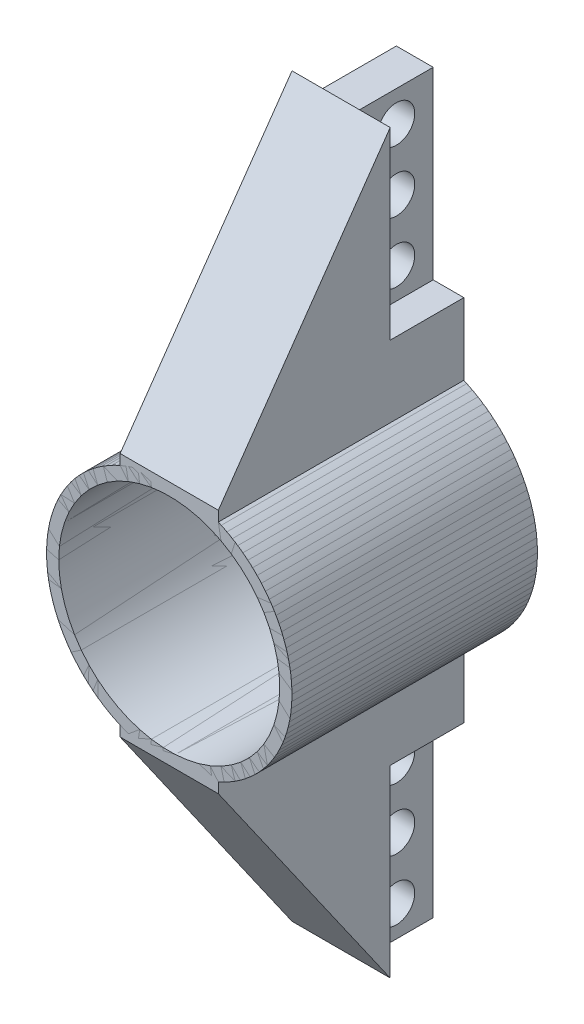
ISO-10303-21;
HEADER;
FILE_DESCRIPTION(('STEP AP214'),'2;1');
FILE_NAME('part.step','',(''),(''),'','','');
FILE_SCHEMA(('AUTOMOTIVE_DESIGN { 1 0 10303 214 1 1 1 1 }'));
ENDSEC;
DATA;
#1=APPLICATION_CONTEXT('core data for automotive mechanical design processes');
#2=APPLICATION_PROTOCOL_DEFINITION('international standard','automotive_design',2000,#1);
#3=PRODUCT_CONTEXT('',#1,'mechanical');
#4=PRODUCT('Part','Part','',(#3));
#5=PRODUCT_RELATED_PRODUCT_CATEGORY('part','',(#4));
#6=PRODUCT_DEFINITION_FORMATION('','',#4);
#7=PRODUCT_DEFINITION_CONTEXT('part definition',#1,'design');
#8=PRODUCT_DEFINITION('design','',#6,#7);
#9=PRODUCT_DEFINITION_SHAPE('','',#8);
#10=(LENGTH_UNIT() NAMED_UNIT(*) SI_UNIT(.MILLI.,.METRE.));
#11=(NAMED_UNIT(*) PLANE_ANGLE_UNIT() SI_UNIT($,.RADIAN.));
#12=(NAMED_UNIT(*) SI_UNIT($,.STERADIAN.) SOLID_ANGLE_UNIT());
#13=UNCERTAINTY_MEASURE_WITH_UNIT(LENGTH_MEASURE(1.E-05),#10,'distance_accuracy_value','');
#14=(GEOMETRIC_REPRESENTATION_CONTEXT(3) GLOBAL_UNCERTAINTY_ASSIGNED_CONTEXT((#13)) GLOBAL_UNIT_ASSIGNED_CONTEXT((#10,
#11,#12)) REPRESENTATION_CONTEXT('',''));
#15=CARTESIAN_POINT('',(0.,0.,0.));
#16=DIRECTION('',(0.,0.,1.));
#17=DIRECTION('',(1.,0.,0.));
#18=AXIS2_PLACEMENT_3D('',#15,#16,#17);
#19=CARTESIAN_POINT('',(0.,0.,20.));
#20=DIRECTION('',(0.,0.,-1.));
#21=DIRECTION('',(1.,0.,0.));
#22=AXIS2_PLACEMENT_3D('',#19,#20,#21);
#23=CYLINDRICAL_SURFACE('',#22,10.);
#24=DIRECTION('',(0.,0.,-1.));
#25=VECTOR('',#24,1.);
#26=CARTESIAN_POINT('',(-3.99999999999994,-9.16515138991171,20.));
#27=LINE('',#26,#25);
#28=CARTESIAN_POINT('',(-3.99999999999994,-9.16515138991171,20.));
#29=VERTEX_POINT('',#28);
#30=CARTESIAN_POINT('',(-3.99999999999994,-9.16515138991171,0.));
#31=VERTEX_POINT('',#30);
#32=EDGE_CURVE('E208',#29,#31,#27,.T.);
#33=ORIENTED_EDGE('',*,*,#32,.F.);
#34=CARTESIAN_POINT('',(0.,0.,20.));
#35=DIRECTION('',(0.,0.,1.));
#36=DIRECTION('',(-1.,0.,0.));
#37=AXIS2_PLACEMENT_3D('',#34,#35,#36);
#38=CIRCLE('',#37,10.);
#39=CARTESIAN_POINT('',(4.00000000000006,-9.16515138991165,20.));
#40=VERTEX_POINT('',#39);
#41=EDGE_CURVE('E12',#40,#29,#38,.T.);
#42=ORIENTED_EDGE('',*,*,#41,.F.);
#43=DIRECTION('',(0.,0.,-1.));
#44=VECTOR('',#43,1.);
#45=CARTESIAN_POINT('',(4.00000000000006,-9.16515138991165,20.));
#46=LINE('',#45,#44);
#47=CARTESIAN_POINT('',(4.00000000000006,-9.16515138991165,0.));
#48=VERTEX_POINT('',#47);
#49=EDGE_CURVE('E206',#40,#48,#46,.T.);
#50=ORIENTED_EDGE('',*,*,#49,.T.);
#51=CARTESIAN_POINT('',(0.,0.,0.));
#52=DIRECTION('',(0.,0.,1.));
#53=DIRECTION('',(-1.,0.,0.));
#54=AXIS2_PLACEMENT_3D('',#51,#52,#53);
#55=CIRCLE('',#54,10.);
#56=EDGE_CURVE('E63',#48,#31,#55,.T.);
#57=ORIENTED_EDGE('',*,*,#56,.T.);
#58=EDGE_LOOP('',(#33,#42,#50,#57));
#59=FACE_BOUND('',#58,.T.);
#60=ADVANCED_FACE('F55',(#59),#23,.T.);
#61=CARTESIAN_POINT('',(0.,0.,20.));
#62=DIRECTION('',(0.,0.,-1.));
#63=DIRECTION('',(1.,0.,0.));
#64=AXIS2_PLACEMENT_3D('',#61,#62,#63);
#65=CYLINDRICAL_SURFACE('',#64,9.);
#66=CARTESIAN_POINT('',(0.,0.,0.));
#67=DIRECTION('',(0.,0.,1.));
#68=DIRECTION('',(-1.,0.,0.));
#69=AXIS2_PLACEMENT_3D('',#66,#67,#68);
#70=CIRCLE('',#69,9.);
#71=CARTESIAN_POINT('',(-9.,0.,0.));
#72=VERTEX_POINT('',#71);
#73=EDGE_CURVE('E210',#72,#72,#70,.T.);
#74=ORIENTED_EDGE('',*,*,#73,.F.);
#75=EDGE_LOOP('',(#74));
#76=FACE_BOUND('',#75,.T.);
#77=CARTESIAN_POINT('',(0.,0.,20.));
#78=DIRECTION('',(0.,0.,1.));
#79=DIRECTION('',(-1.,0.,0.));
#80=AXIS2_PLACEMENT_3D('',#77,#78,#79);
#81=CIRCLE('',#80,9.);
#82=CARTESIAN_POINT('',(-9.,0.,20.));
#83=VERTEX_POINT('',#82);
#84=EDGE_CURVE('E211',#83,#83,#81,.T.);
#85=ORIENTED_EDGE('',*,*,#84,.T.);
#86=EDGE_LOOP('',(#85));
#87=FACE_BOUND('',#86,.T.);
#88=ADVANCED_FACE('F243',(#76,#87),#65,.F.);
#89=CARTESIAN_POINT('',(0.,0.,20.));
#90=DIRECTION('',(0.,0.,1.));
#91=DIRECTION('',(-1.,0.,0.));
#92=AXIS2_PLACEMENT_3D('',#89,#90,#91);
#93=PLANE('',#92);
#94=ORIENTED_EDGE('',*,*,#84,.F.);
#95=EDGE_LOOP('',(#94));
#96=FACE_BOUND('',#95,.T.);
#97=ORIENTED_EDGE('',*,*,#41,.T.);
#98=DIRECTION('',(0.,1.,0.));
#99=VECTOR('',#98,1.);
#100=CARTESIAN_POINT('',(-3.99999999999993,-10.,20.));
#101=LINE('',#100,#99);
#102=CARTESIAN_POINT('',(-3.99999999999993,-10.,20.));
#103=VERTEX_POINT('',#102);
#104=EDGE_CURVE('E187',#103,#29,#101,.T.);
#105=ORIENTED_EDGE('',*,*,#104,.F.);
#106=DIRECTION('',(1.,0.,0.));
#107=VECTOR('',#106,1.);
#108=CARTESIAN_POINT('',(-3.99999999999993,-10.,20.));
#109=LINE('',#108,#107);
#110=CARTESIAN_POINT('',(4.00000000000007,-9.99999999999997,20.));
#111=VERTEX_POINT('',#110);
#112=EDGE_CURVE('E204',#103,#111,#109,.T.);
#113=ORIENTED_EDGE('',*,*,#112,.T.);
#114=DIRECTION('',(0.,1.,0.));
#115=VECTOR('',#114,1.);
#116=CARTESIAN_POINT('',(4.00000000000007,-9.99999999999997,20.));
#117=LINE('',#116,#115);
#118=EDGE_CURVE('E194',#111,#40,#117,.T.);
#119=ORIENTED_EDGE('',*,*,#118,.T.);
#120=EDGE_LOOP('',(#97,#105,#113,#119));
#121=FACE_BOUND('',#120,.T.);
#122=ADVANCED_FACE('F249',(#96,#121),#93,.T.);
#123=CARTESIAN_POINT('',(0.,0.,0.));
#124=DIRECTION('',(0.,0.,1.));
#125=DIRECTION('',(-1.,0.,0.));
#126=AXIS2_PLACEMENT_3D('',#123,#124,#125);
#127=PLANE('',#126);
#128=ORIENTED_EDGE('',*,*,#73,.T.);
#129=EDGE_LOOP('',(#128));
#130=FACE_BOUND('',#129,.T.);
#131=DIRECTION('',(1.,0.,0.));
#132=VECTOR('',#131,1.);
#133=CARTESIAN_POINT('',(4.0000000000001,-15.,0.));
#134=LINE('',#133,#132);
#135=CARTESIAN_POINT('',(1.5000000000001,-15.,0.));
#136=VERTEX_POINT('',#135);
#137=CARTESIAN_POINT('',(4.0000000000001,-15.,0.));
#138=VERTEX_POINT('',#137);
#139=EDGE_CURVE('E150',#136,#138,#134,.T.);
#140=ORIENTED_EDGE('',*,*,#139,.F.);
#141=DIRECTION('',(0.,-1.,0.));
#142=VECTOR('',#141,1.);
#143=CARTESIAN_POINT('',(1.5000000000001,-15.,0.));
#144=LINE('',#143,#142);
#145=CARTESIAN_POINT('',(1.50000000000021,-30.,0.));
#146=VERTEX_POINT('',#145);
#147=EDGE_CURVE('E159',#136,#146,#144,.T.);
#148=ORIENTED_EDGE('',*,*,#147,.T.);
#149=DIRECTION('',(1.,0.,0.));
#150=VECTOR('',#149,1.);
#151=CARTESIAN_POINT('',(-3.99999999999979,-30.,0.));
#152=LINE('',#151,#150);
#153=CARTESIAN_POINT('',(-1.49999999999979,-30.,0.));
#154=VERTEX_POINT('',#153);
#155=EDGE_CURVE('E201',#154,#146,#152,.T.);
#156=ORIENTED_EDGE('',*,*,#155,.F.);
#157=DIRECTION('',(0.,-1.,0.));
#158=VECTOR('',#157,1.);
#159=CARTESIAN_POINT('',(-1.4999999999999,-15.,0.));
#160=LINE('',#159,#158);
#161=CARTESIAN_POINT('',(-1.4999999999999,-15.,0.));
#162=VERTEX_POINT('',#161);
#163=EDGE_CURVE('E71',#162,#154,#160,.T.);
#164=ORIENTED_EDGE('',*,*,#163,.F.);
#165=DIRECTION('',(1.,0.,0.));
#166=VECTOR('',#165,1.);
#167=CARTESIAN_POINT('',(-3.9999999999999,-15.,0.));
#168=LINE('',#167,#166);
#169=CARTESIAN_POINT('',(-3.9999999999999,-15.,0.));
#170=VERTEX_POINT('',#169);
#171=EDGE_CURVE('E180',#170,#162,#168,.T.);
#172=ORIENTED_EDGE('',*,*,#171,.F.);
#173=DIRECTION('',(0.,-1.,0.));
#174=VECTOR('',#173,1.);
#175=CARTESIAN_POINT('',(-3.99999999999996,-6.50000000000003,0.));
#176=LINE('',#175,#174);
#177=EDGE_CURVE('E189',#31,#170,#176,.T.);
#178=ORIENTED_EDGE('',*,*,#177,.F.);
#179=ORIENTED_EDGE('',*,*,#56,.F.);
#180=DIRECTION('',(0.,-1.,0.));
#181=VECTOR('',#180,1.);
#182=CARTESIAN_POINT('',(4.00000000000005,-6.49999999999997,0.));
#183=LINE('',#182,#181);
#184=EDGE_CURVE('E79',#48,#138,#183,.T.);
#185=ORIENTED_EDGE('',*,*,#184,.T.);
#186=EDGE_LOOP('',(#140,#148,#156,#164,#172,#178,#179,#185));
#187=FACE_BOUND('',#186,.T.);
#188=ADVANCED_FACE('F271',(#130,#187),#127,.F.);
#189=CARTESIAN_POINT('',(-4.,0.,0.));
#190=DIRECTION('',(1.,0.,0.));
#191=DIRECTION('',(0.,0.,1.));
#192=AXIS2_PLACEMENT_3D('',#189,#190,#191);
#193=PLANE('',#192);
#194=DIRECTION('',(0.,0.,-1.));
#195=VECTOR('',#194,1.);
#196=CARTESIAN_POINT('',(-3.9999999999999,-15.,6.));
#197=LINE('',#196,#195);
#198=CARTESIAN_POINT('',(-3.9999999999999,-15.,6.));
#199=VERTEX_POINT('',#198);
#200=EDGE_CURVE('E174',#199,#170,#197,.T.);
#201=ORIENTED_EDGE('',*,*,#200,.F.);
#202=DIRECTION('',(0.,-1.,0.));
#203=VECTOR('',#202,1.);
#204=CARTESIAN_POINT('',(-3.9999999999999,-15.,6.));
#205=LINE('',#204,#203);
#206=CARTESIAN_POINT('',(-3.99999999999979,-30.,6.));
#207=VERTEX_POINT('',#206);
#208=EDGE_CURVE('E168',#199,#207,#205,.T.);
#209=ORIENTED_EDGE('',*,*,#208,.T.);
#210=DIRECTION('',(0.,0.81923192051904,0.573462344363328));
#211=VECTOR('',#210,1.);
#212=CARTESIAN_POINT('',(-3.99999999999993,-10.,20.));
#213=LINE('',#212,#211);
#214=EDGE_CURVE('E184',#207,#103,#213,.T.);
#215=ORIENTED_EDGE('',*,*,#214,.T.);
#216=ORIENTED_EDGE('',*,*,#104,.T.);
#217=ORIENTED_EDGE('',*,*,#32,.T.);
#218=ORIENTED_EDGE('',*,*,#177,.T.);
#219=EDGE_LOOP('',(#201,#209,#215,#216,#217,#218));
#220=FACE_BOUND('',#219,.T.);
#221=ADVANCED_FACE('F283',(#220),#193,.F.);
#222=CARTESIAN_POINT('',(4.,0.,0.));
#223=DIRECTION('',(1.,0.,0.));
#224=DIRECTION('',(0.,0.,1.));
#225=AXIS2_PLACEMENT_3D('',#222,#223,#224);
#226=PLANE('',#225);
#227=DIRECTION('',(0.,-1.,0.));
#228=VECTOR('',#227,1.);
#229=CARTESIAN_POINT('',(4.0000000000001,-15.,6.));
#230=LINE('',#229,#228);
#231=CARTESIAN_POINT('',(4.0000000000001,-15.,6.));
#232=VERTEX_POINT('',#231);
#233=CARTESIAN_POINT('',(4.00000000000021,-30.,6.));
#234=VERTEX_POINT('',#233);
#235=EDGE_CURVE('E139',#232,#234,#230,.T.);
#236=ORIENTED_EDGE('',*,*,#235,.F.);
#237=DIRECTION('',(0.,0.,1.));
#238=VECTOR('',#237,1.);
#239=CARTESIAN_POINT('',(4.0000000000001,-15.,6.));
#240=LINE('',#239,#238);
#241=EDGE_CURVE('E146',#138,#232,#240,.T.);
#242=ORIENTED_EDGE('',*,*,#241,.F.);
#243=ORIENTED_EDGE('',*,*,#184,.F.);
#244=ORIENTED_EDGE('',*,*,#49,.F.);
#245=ORIENTED_EDGE('',*,*,#118,.F.);
#246=DIRECTION('',(0.,0.81923192051904,0.573462344363328));
#247=VECTOR('',#246,1.);
#248=CARTESIAN_POINT('',(4.00000000000007,-9.99999999999997,20.));
#249=LINE('',#248,#247);
#250=EDGE_CURVE('E157',#234,#111,#249,.T.);
#251=ORIENTED_EDGE('',*,*,#250,.F.);
#252=EDGE_LOOP('',(#236,#242,#243,#244,#245,#251));
#253=FACE_BOUND('',#252,.T.);
#254=ADVANCED_FACE('F154',(#253),#226,.T.);
#255=CARTESIAN_POINT('',(-3.99999999999993,-10.,20.));
#256=DIRECTION('',(0.,0.573462344363329,-0.819231920519041));
#257=DIRECTION('',(0.,-0.81923192051904,-0.573462344363328));
#258=AXIS2_PLACEMENT_3D('',#255,#256,#257);
#259=PLANE('',#258);
#260=ORIENTED_EDGE('',*,*,#250,.T.);
#261=ORIENTED_EDGE('',*,*,#112,.F.);
#262=ORIENTED_EDGE('',*,*,#214,.F.);
#263=DIRECTION('',(1.,0.,0.));
#264=VECTOR('',#263,1.);
#265=CARTESIAN_POINT('',(-3.99999999999979,-30.,6.));
#266=LINE('',#265,#264);
#267=CARTESIAN_POINT('',(-1.49999999999979,-30.,6.));
#268=VERTEX_POINT('',#267);
#269=EDGE_CURVE('E198',#207,#268,#266,.T.);
#270=ORIENTED_EDGE('',*,*,#269,.T.);
#271=CARTESIAN_POINT('',(1.50000000000021,-30.,6.));
#272=VERTEX_POINT('',#271);
#273=EDGE_CURVE('E192',#268,#272,#266,.T.);
#274=ORIENTED_EDGE('',*,*,#273,.T.);
#275=DIRECTION('',(-1.,0.,0.));
#276=VECTOR('',#275,1.);
#277=CARTESIAN_POINT('',(1.50000000000021,-30.,6.));
#278=LINE('',#277,#276);
#279=EDGE_CURVE('E173',#234,#272,#278,.T.);
#280=ORIENTED_EDGE('',*,*,#279,.F.);
#281=EDGE_LOOP('',(#260,#261,#262,#270,#274,#280));
#282=FACE_BOUND('',#281,.T.);
#283=ADVANCED_FACE('F260',(#282),#259,.F.);
#284=CARTESIAN_POINT('',(-3.99999999999979,-30.,6.));
#285=DIRECTION('',(0.,1.,0.));
#286=DIRECTION('',(0.,0.,-1.));
#287=AXIS2_PLACEMENT_3D('',#284,#285,#286);
#288=PLANE('',#287);
#289=ORIENTED_EDGE('',*,*,#155,.T.);
#290=DIRECTION('',(0.,0.,-1.));
#291=VECTOR('',#290,1.);
#292=CARTESIAN_POINT('',(1.50000000000021,-30.,0.));
#293=LINE('',#292,#291);
#294=EDGE_CURVE('E151',#272,#146,#293,.T.);
#295=ORIENTED_EDGE('',*,*,#294,.F.);
#296=ORIENTED_EDGE('',*,*,#273,.F.);
#297=DIRECTION('',(0.,0.,1.));
#298=VECTOR('',#297,1.);
#299=CARTESIAN_POINT('',(-1.49999999999979,-30.,0.));
#300=LINE('',#299,#298);
#301=EDGE_CURVE('E171',#154,#268,#300,.T.);
#302=ORIENTED_EDGE('',*,*,#301,.F.);
#303=EDGE_LOOP('',(#289,#295,#296,#302));
#304=FACE_BOUND('',#303,.T.);
#305=ADVANCED_FACE('F274',(#304),#288,.F.);
#306=CARTESIAN_POINT('',(-1.4999999999999,-15.,6.));
#307=DIRECTION('',(0.,0.,1.));
#308=DIRECTION('',(-1.,0.,0.));
#309=AXIS2_PLACEMENT_3D('',#306,#307,#308);
#310=PLANE('',#309);
#311=ORIENTED_EDGE('',*,*,#269,.F.);
#312=ORIENTED_EDGE('',*,*,#208,.F.);
#313=DIRECTION('',(-1.,0.,0.));
#314=VECTOR('',#313,1.);
#315=CARTESIAN_POINT('',(-1.4999999999999,-15.,6.));
#316=LINE('',#315,#314);
#317=CARTESIAN_POINT('',(-1.4999999999999,-15.,6.));
#318=VERTEX_POINT('',#317);
#319=EDGE_CURVE('E165',#318,#199,#316,.T.);
#320=ORIENTED_EDGE('',*,*,#319,.F.);
#321=DIRECTION('',(0.,-1.,0.));
#322=VECTOR('',#321,1.);
#323=CARTESIAN_POINT('',(-1.4999999999999,-15.,6.));
#324=LINE('',#323,#322);
#325=EDGE_CURVE('E166',#318,#268,#324,.T.);
#326=ORIENTED_EDGE('',*,*,#325,.T.);
#327=EDGE_LOOP('',(#311,#312,#320,#326));
#328=FACE_BOUND('',#327,.T.);
#329=ADVANCED_FACE('F282',(#328),#310,.F.);
#330=CARTESIAN_POINT('',(-1.4999999999999,-15.,0.));
#331=DIRECTION('',(1.,0.,0.));
#332=DIRECTION('',(0.,0.,1.));
#333=AXIS2_PLACEMENT_3D('',#330,#331,#332);
#334=PLANE('',#333);
#335=CARTESIAN_POINT('',(-1.49999999999988,-17.5,3.));
#336=DIRECTION('',(-1.,0.,0.));
#337=DIRECTION('',(0.,-1.,0.));
#338=AXIS2_PLACEMENT_3D('',#335,#336,#337);
#339=CIRCLE('',#338,1.5);
#340=CARTESIAN_POINT('',(-1.49999999999987,-19.,3.));
#341=VERTEX_POINT('',#340);
#342=EDGE_CURVE('E221',#341,#341,#339,.T.);
#343=ORIENTED_EDGE('',*,*,#342,.F.);
#344=EDGE_LOOP('',(#343));
#345=FACE_BOUND('',#344,.T.);
#346=CARTESIAN_POINT('',(-1.49999999999984,-22.5,3.));
#347=DIRECTION('',(-1.,0.,0.));
#348=DIRECTION('',(0.,-1.,0.));
#349=AXIS2_PLACEMENT_3D('',#346,#347,#348);
#350=CIRCLE('',#349,1.5);
#351=CARTESIAN_POINT('',(-1.49999999999983,-24.,3.));
#352=VERTEX_POINT('',#351);
#353=EDGE_CURVE('E429',#352,#352,#350,.T.);
#354=ORIENTED_EDGE('',*,*,#353,.F.);
#355=EDGE_LOOP('',(#354));
#356=FACE_BOUND('',#355,.T.);
#357=CARTESIAN_POINT('',(-1.49999999999981,-27.5,3.));
#358=DIRECTION('',(-1.,0.,0.));
#359=DIRECTION('',(0.,-1.,0.));
#360=AXIS2_PLACEMENT_3D('',#357,#358,#359);
#361=CIRCLE('',#360,1.5);
#362=CARTESIAN_POINT('',(-1.4999999999998,-29.,3.));
#363=VERTEX_POINT('',#362);
#364=EDGE_CURVE('E424',#363,#363,#361,.T.);
#365=ORIENTED_EDGE('',*,*,#364,.F.);
#366=EDGE_LOOP('',(#365));
#367=FACE_BOUND('',#366,.T.);
#368=ORIENTED_EDGE('',*,*,#301,.T.);
#369=ORIENTED_EDGE('',*,*,#325,.F.);
#370=DIRECTION('',(0.,0.,1.));
#371=VECTOR('',#370,1.);
#372=CARTESIAN_POINT('',(-1.4999999999999,-15.,0.));
#373=LINE('',#372,#371);
#374=EDGE_CURVE('E177',#162,#318,#373,.T.);
#375=ORIENTED_EDGE('',*,*,#374,.F.);
#376=ORIENTED_EDGE('',*,*,#163,.T.);
#377=EDGE_LOOP('',(#368,#369,#375,#376));
#378=FACE_BOUND('',#377,.T.);
#379=ADVANCED_FACE('F275',(#345,#356,#367,#378),#334,.F.);
#380=CARTESIAN_POINT('',(1.04744440165294E-13,-15.,0.));
#381=DIRECTION('',(0.,-1.,0.));
#382=DIRECTION('',(0.,0.,1.));
#383=AXIS2_PLACEMENT_3D('',#380,#381,#382);
#384=PLANE('',#383);
#385=ORIENTED_EDGE('',*,*,#200,.T.);
#386=ORIENTED_EDGE('',*,*,#171,.T.);
#387=ORIENTED_EDGE('',*,*,#374,.T.);
#388=ORIENTED_EDGE('',*,*,#319,.T.);
#389=EDGE_LOOP('',(#385,#386,#387,#388));
#390=FACE_BOUND('',#389,.T.);
#391=ADVANCED_FACE('F279',(#390),#384,.T.);
#392=CARTESIAN_POINT('',(1.5000000000001,-15.,0.));
#393=DIRECTION('',(-1.,0.,0.));
#394=DIRECTION('',(0.,0.,-1.));
#395=AXIS2_PLACEMENT_3D('',#392,#393,#394);
#396=PLANE('',#395);
#397=CARTESIAN_POINT('',(1.50000000000012,-17.5,3.));
#398=DIRECTION('',(-1.,0.,0.));
#399=DIRECTION('',(0.,-1.,0.));
#400=AXIS2_PLACEMENT_3D('',#397,#398,#399);
#401=CIRCLE('',#400,1.5);
#402=CARTESIAN_POINT('',(1.50000000000013,-19.,3.));
#403=VERTEX_POINT('',#402);
#404=EDGE_CURVE('E58',#403,#403,#401,.T.);
#405=ORIENTED_EDGE('',*,*,#404,.T.);
#406=EDGE_LOOP('',(#405));
#407=FACE_BOUND('',#406,.T.);
#408=CARTESIAN_POINT('',(1.50000000000016,-22.5,3.));
#409=DIRECTION('',(-1.,0.,0.));
#410=DIRECTION('',(0.,-1.,0.));
#411=AXIS2_PLACEMENT_3D('',#408,#409,#410);
#412=CIRCLE('',#411,1.5);
#413=CARTESIAN_POINT('',(1.50000000000017,-24.,3.));
#414=VERTEX_POINT('',#413);
#415=EDGE_CURVE('E220',#414,#414,#412,.T.);
#416=ORIENTED_EDGE('',*,*,#415,.T.);
#417=EDGE_LOOP('',(#416));
#418=FACE_BOUND('',#417,.T.);
#419=CARTESIAN_POINT('',(1.50000000000019,-27.5,3.));
#420=DIRECTION('',(-1.,0.,0.));
#421=DIRECTION('',(0.,-1.,0.));
#422=AXIS2_PLACEMENT_3D('',#419,#420,#421);
#423=CIRCLE('',#422,1.5);
#424=CARTESIAN_POINT('',(1.5000000000002,-29.,3.));
#425=VERTEX_POINT('',#424);
#426=EDGE_CURVE('E218',#425,#425,#423,.T.);
#427=ORIENTED_EDGE('',*,*,#426,.T.);
#428=EDGE_LOOP('',(#427));
#429=FACE_BOUND('',#428,.T.);
#430=ORIENTED_EDGE('',*,*,#294,.T.);
#431=ORIENTED_EDGE('',*,*,#147,.F.);
#432=DIRECTION('',(0.,0.,-1.));
#433=VECTOR('',#432,1.);
#434=CARTESIAN_POINT('',(1.5000000000001,-15.,0.));
#435=LINE('',#434,#433);
#436=CARTESIAN_POINT('',(1.5000000000001,-15.,6.));
#437=VERTEX_POINT('',#436);
#438=EDGE_CURVE('E145',#437,#136,#435,.T.);
#439=ORIENTED_EDGE('',*,*,#438,.F.);
#440=DIRECTION('',(0.,-1.,0.));
#441=VECTOR('',#440,1.);
#442=CARTESIAN_POINT('',(1.5000000000001,-15.,6.));
#443=LINE('',#442,#441);
#444=EDGE_CURVE('E141',#437,#272,#443,.T.);
#445=ORIENTED_EDGE('',*,*,#444,.T.);
#446=EDGE_LOOP('',(#430,#431,#439,#445));
#447=FACE_BOUND('',#446,.T.);
#448=ADVANCED_FACE('F228',(#407,#418,#429,#447),#396,.F.);
#449=CARTESIAN_POINT('',(1.5000000000001,-15.,6.));
#450=DIRECTION('',(0.,0.,1.));
#451=DIRECTION('',(-1.,0.,0.));
#452=AXIS2_PLACEMENT_3D('',#449,#450,#451);
#453=PLANE('',#452);
#454=ORIENTED_EDGE('',*,*,#279,.T.);
#455=ORIENTED_EDGE('',*,*,#444,.F.);
#456=DIRECTION('',(-1.,0.,0.));
#457=VECTOR('',#456,1.);
#458=CARTESIAN_POINT('',(1.5000000000001,-15.,6.));
#459=LINE('',#458,#457);
#460=EDGE_CURVE('E134',#232,#437,#459,.T.);
#461=ORIENTED_EDGE('',*,*,#460,.F.);
#462=ORIENTED_EDGE('',*,*,#235,.T.);
#463=EDGE_LOOP('',(#454,#455,#461,#462));
#464=FACE_BOUND('',#463,.T.);
#465=ADVANCED_FACE('F137',(#464),#453,.F.);
#466=CARTESIAN_POINT('',(1.04744440165294E-13,-15.,0.));
#467=DIRECTION('',(0.,1.,0.));
#468=DIRECTION('',(0.,0.,-1.));
#469=AXIS2_PLACEMENT_3D('',#466,#467,#468);
#470=PLANE('',#469);
#471=ORIENTED_EDGE('',*,*,#241,.T.);
#472=ORIENTED_EDGE('',*,*,#460,.T.);
#473=ORIENTED_EDGE('',*,*,#438,.T.);
#474=ORIENTED_EDGE('',*,*,#139,.T.);
#475=EDGE_LOOP('',(#471,#472,#473,#474));
#476=FACE_BOUND('',#475,.T.);
#477=ADVANCED_FACE('F148',(#476),#470,.F.);
#478=CARTESIAN_POINT('',(10.0000000000004,-27.4999999999999,3.));
#479=DIRECTION('',(-1.,0.,0.));
#480=DIRECTION('',(0.,-1.,0.));
#481=AXIS2_PLACEMENT_3D('',#478,#479,#480);
#482=CYLINDRICAL_SURFACE('',#481,1.5);
#483=ORIENTED_EDGE('',*,*,#364,.T.);
#484=EDGE_LOOP('',(#483));
#485=FACE_BOUND('',#484,.T.);
#486=ORIENTED_EDGE('',*,*,#426,.F.);
#487=EDGE_LOOP('',(#486));
#488=FACE_BOUND('',#487,.T.);
#489=ADVANCED_FACE('F238',(#485,#488),#482,.F.);
#490=CARTESIAN_POINT('',(10.0000000000004,-22.4999999999999,3.));
#491=DIRECTION('',(-1.,0.,0.));
#492=DIRECTION('',(0.,-1.,0.));
#493=AXIS2_PLACEMENT_3D('',#490,#491,#492);
#494=CYLINDRICAL_SURFACE('',#493,1.5);
#495=ORIENTED_EDGE('',*,*,#353,.T.);
#496=EDGE_LOOP('',(#495));
#497=FACE_BOUND('',#496,.T.);
#498=ORIENTED_EDGE('',*,*,#415,.F.);
#499=EDGE_LOOP('',(#498));
#500=FACE_BOUND('',#499,.T.);
#501=ADVANCED_FACE('F232',(#497,#500),#494,.F.);
#502=CARTESIAN_POINT('',(10.0000000000003,-17.4999999999999,3.));
#503=DIRECTION('',(-1.,0.,0.));
#504=DIRECTION('',(0.,-1.,0.));
#505=AXIS2_PLACEMENT_3D('',#502,#503,#504);
#506=CYLINDRICAL_SURFACE('',#505,1.5);
#507=ORIENTED_EDGE('',*,*,#342,.T.);
#508=EDGE_LOOP('',(#507));
#509=FACE_BOUND('',#508,.T.);
#510=ORIENTED_EDGE('',*,*,#404,.F.);
#511=EDGE_LOOP('',(#510));
#512=FACE_BOUND('',#511,.T.);
#513=ADVANCED_FACE('F230',(#509,#512),#506,.F.);
#514=CLOSED_SHELL('',(#60,#88,#122,#188,#221,#254,#283,#305,#329,#379,#391,#448,#465,#477,#489,
#501,#513));
#515=MANIFOLD_SOLID_BREP('B2',#514);
#516=CARTESIAN_POINT('',(0.,0.,20.));
#517=DIRECTION('',(0.,0.,-1.));
#518=DIRECTION('',(-1.,0.,0.));
#519=AXIS2_PLACEMENT_3D('',#516,#517,#518);
#520=CYLINDRICAL_SURFACE('',#519,10.);
#521=DIRECTION('',(0.,0.,-1.));
#522=VECTOR('',#521,1.);
#523=CARTESIAN_POINT('',(4.,9.16515138991168,20.));
#524=LINE('',#523,#522);
#525=CARTESIAN_POINT('',(4.,9.16515138991168,20.));
#526=VERTEX_POINT('',#525);
#527=CARTESIAN_POINT('',(4.,9.16515138991168,0.));
#528=VERTEX_POINT('',#527);
#529=EDGE_CURVE('E617',#526,#528,#524,.T.);
#530=ORIENTED_EDGE('',*,*,#529,.F.);
#531=CARTESIAN_POINT('',(0.,0.,20.));
#532=DIRECTION('',(0.,0.,1.));
#533=DIRECTION('',(1.,0.,0.));
#534=AXIS2_PLACEMENT_3D('',#531,#532,#533);
#535=CIRCLE('',#534,10.);
#536=CARTESIAN_POINT('',(-4.,9.16515138991168,20.));
#537=VERTEX_POINT('',#536);
#538=EDGE_CURVE('E53',#537,#526,#535,.T.);
#539=ORIENTED_EDGE('',*,*,#538,.F.);
#540=DIRECTION('',(0.,0.,-1.));
#541=VECTOR('',#540,1.);
#542=CARTESIAN_POINT('',(-4.,9.16515138991168,20.));
#543=LINE('',#542,#541);
#544=CARTESIAN_POINT('',(-4.,9.16515138991168,0.));
#545=VERTEX_POINT('',#544);
#546=EDGE_CURVE('E614',#537,#545,#543,.T.);
#547=ORIENTED_EDGE('',*,*,#546,.T.);
#548=CARTESIAN_POINT('',(0.,0.,0.));
#549=DIRECTION('',(0.,0.,1.));
#550=DIRECTION('',(1.,0.,0.));
#551=AXIS2_PLACEMENT_3D('',#548,#549,#550);
#552=CIRCLE('',#551,10.);
#553=EDGE_CURVE('E444',#545,#528,#552,.T.);
#554=ORIENTED_EDGE('',*,*,#553,.T.);
#555=EDGE_LOOP('',(#530,#539,#547,#554));
#556=FACE_BOUND('',#555,.T.);
#557=ADVANCED_FACE('F441',(#556),#520,.T.);
#558=CARTESIAN_POINT('',(0.,0.,20.));
#559=DIRECTION('',(0.,0.,-1.));
#560=DIRECTION('',(-1.,0.,0.));
#561=AXIS2_PLACEMENT_3D('',#558,#559,#560);
#562=CYLINDRICAL_SURFACE('',#561,9.);
#563=CARTESIAN_POINT('',(0.,0.,0.));
#564=DIRECTION('',(0.,0.,1.));
#565=DIRECTION('',(1.,0.,0.));
#566=AXIS2_PLACEMENT_3D('',#563,#564,#565);
#567=CIRCLE('',#566,9.);
#568=CARTESIAN_POINT('',(9.,0.,0.));
#569=VERTEX_POINT('',#568);
#570=EDGE_CURVE('E620',#569,#569,#567,.T.);
#571=ORIENTED_EDGE('',*,*,#570,.F.);
#572=EDGE_LOOP('',(#571));
#573=FACE_BOUND('',#572,.T.);
#574=CARTESIAN_POINT('',(0.,0.,20.));
#575=DIRECTION('',(0.,0.,1.));
#576=DIRECTION('',(1.,0.,0.));
#577=AXIS2_PLACEMENT_3D('',#574,#575,#576);
#578=CIRCLE('',#577,9.);
#579=CARTESIAN_POINT('',(9.,0.,20.));
#580=VERTEX_POINT('',#579);
#581=EDGE_CURVE('E621',#580,#580,#578,.T.);
#582=ORIENTED_EDGE('',*,*,#581,.T.);
#583=EDGE_LOOP('',(#582));
#584=FACE_BOUND('',#583,.T.);
#585=ADVANCED_FACE('F632',(#573,#584),#562,.F.);
#586=CARTESIAN_POINT('',(0.,0.,20.));
#587=DIRECTION('',(0.,0.,1.));
#588=DIRECTION('',(1.,0.,0.));
#589=AXIS2_PLACEMENT_3D('',#586,#587,#588);
#590=PLANE('',#589);
#591=ORIENTED_EDGE('',*,*,#581,.F.);
#592=EDGE_LOOP('',(#591));
#593=FACE_BOUND('',#592,.T.);
#594=ORIENTED_EDGE('',*,*,#538,.T.);
#595=DIRECTION('',(0.,-1.,0.));
#596=VECTOR('',#595,1.);
#597=CARTESIAN_POINT('',(4.,10.,20.));
#598=LINE('',#597,#596);
#599=CARTESIAN_POINT('',(4.,10.,20.));
#600=VERTEX_POINT('',#599);
#601=EDGE_CURVE('E587',#600,#526,#598,.T.);
#602=ORIENTED_EDGE('',*,*,#601,.F.);
#603=DIRECTION('',(-1.,0.,0.));
#604=VECTOR('',#603,1.);
#605=CARTESIAN_POINT('',(4.,10.,20.));
#606=LINE('',#605,#604);
#607=CARTESIAN_POINT('',(-4.,10.,20.));
#608=VERTEX_POINT('',#607);
#609=EDGE_CURVE('E611',#600,#608,#606,.T.);
#610=ORIENTED_EDGE('',*,*,#609,.T.);
#611=DIRECTION('',(0.,-1.,0.));
#612=VECTOR('',#611,1.);
#613=CARTESIAN_POINT('',(-4.,10.,20.));
#614=LINE('',#613,#612);
#615=EDGE_CURVE('E597',#608,#537,#614,.T.);
#616=ORIENTED_EDGE('',*,*,#615,.T.);
#617=EDGE_LOOP('',(#594,#602,#610,#616));
#618=FACE_BOUND('',#617,.T.);
#619=ADVANCED_FACE('F635',(#593,#618),#590,.T.);
#620=CARTESIAN_POINT('',(0.,0.,0.));
#621=DIRECTION('',(0.,0.,1.));
#622=DIRECTION('',(1.,0.,0.));
#623=AXIS2_PLACEMENT_3D('',#620,#621,#622);
#624=PLANE('',#623);
#625=ORIENTED_EDGE('',*,*,#570,.T.);
#626=EDGE_LOOP('',(#625));
#627=FACE_BOUND('',#626,.T.);
#628=DIRECTION('',(-1.,0.,0.));
#629=VECTOR('',#628,1.);
#630=CARTESIAN_POINT('',(-4.,15.,0.));
#631=LINE('',#630,#629);
#632=CARTESIAN_POINT('',(-1.5,15.,0.));
#633=VERTEX_POINT('',#632);
#634=CARTESIAN_POINT('',(-4.,15.,0.));
#635=VERTEX_POINT('',#634);
#636=EDGE_CURVE('E536',#633,#635,#631,.T.);
#637=ORIENTED_EDGE('',*,*,#636,.F.);
#638=DIRECTION('',(0.,1.,0.));
#639=VECTOR('',#638,1.);
#640=CARTESIAN_POINT('',(-1.5,15.,0.));
#641=LINE('',#640,#639);
#642=CARTESIAN_POINT('',(-1.5,30.,0.));
#643=VERTEX_POINT('',#642);
#644=EDGE_CURVE('E549',#633,#643,#641,.T.);
#645=ORIENTED_EDGE('',*,*,#644,.T.);
#646=DIRECTION('',(-1.,0.,0.));
#647=VECTOR('',#646,1.);
#648=CARTESIAN_POINT('',(4.,30.,0.));
#649=LINE('',#648,#647);
#650=CARTESIAN_POINT('',(1.5,30.,0.));
#651=VERTEX_POINT('',#650);
#652=EDGE_CURVE('E607',#651,#643,#649,.T.);
#653=ORIENTED_EDGE('',*,*,#652,.F.);
#654=DIRECTION('',(0.,1.,0.));
#655=VECTOR('',#654,1.);
#656=CARTESIAN_POINT('',(1.5,15.,0.));
#657=LINE('',#656,#655);
#658=CARTESIAN_POINT('',(1.5,15.,0.));
#659=VERTEX_POINT('',#658);
#660=EDGE_CURVE('E456',#659,#651,#657,.T.);
#661=ORIENTED_EDGE('',*,*,#660,.F.);
#662=DIRECTION('',(-1.,0.,0.));
#663=VECTOR('',#662,1.);
#664=CARTESIAN_POINT('',(4.,15.,0.));
#665=LINE('',#664,#663);
#666=CARTESIAN_POINT('',(4.,15.,0.));
#667=VERTEX_POINT('',#666);
#668=EDGE_CURVE('E577',#667,#659,#665,.T.);
#669=ORIENTED_EDGE('',*,*,#668,.F.);
#670=DIRECTION('',(0.,1.,0.));
#671=VECTOR('',#670,1.);
#672=CARTESIAN_POINT('',(4.,6.5,0.));
#673=LINE('',#672,#671);
#674=EDGE_CURVE('E590',#528,#667,#673,.T.);
#675=ORIENTED_EDGE('',*,*,#674,.F.);
#676=ORIENTED_EDGE('',*,*,#553,.F.);
#677=DIRECTION('',(0.,1.,0.));
#678=VECTOR('',#677,1.);
#679=CARTESIAN_POINT('',(-4.,6.5,0.));
#680=LINE('',#679,#678);
#681=EDGE_CURVE('E464',#545,#635,#680,.T.);
#682=ORIENTED_EDGE('',*,*,#681,.T.);
#683=EDGE_LOOP('',(#637,#645,#653,#661,#669,#675,#676,#682));
#684=FACE_BOUND('',#683,.T.);
#685=ADVANCED_FACE('F629',(#627,#684),#624,.F.);
#686=CARTESIAN_POINT('',(4.,0.,0.));
#687=DIRECTION('',(-1.,0.,0.));
#688=DIRECTION('',(0.,0.,1.));
#689=AXIS2_PLACEMENT_3D('',#686,#687,#688);
#690=PLANE('',#689);
#691=DIRECTION('',(0.,0.,-1.));
#692=VECTOR('',#691,1.);
#693=CARTESIAN_POINT('',(4.,15.,6.));
#694=LINE('',#693,#692);
#695=CARTESIAN_POINT('',(4.,15.,6.));
#696=VERTEX_POINT('',#695);
#697=EDGE_CURVE('E569',#696,#667,#694,.T.);
#698=ORIENTED_EDGE('',*,*,#697,.F.);
#699=DIRECTION('',(0.,1.,0.));
#700=VECTOR('',#699,1.);
#701=CARTESIAN_POINT('',(4.,15.,6.));
#702=LINE('',#701,#700);
#703=CARTESIAN_POINT('',(4.,30.,6.));
#704=VERTEX_POINT('',#703);
#705=EDGE_CURVE('E560',#696,#704,#702,.T.);
#706=ORIENTED_EDGE('',*,*,#705,.T.);
#707=DIRECTION('',(0.,-0.81923192051904,0.573462344363328));
#708=VECTOR('',#707,1.);
#709=CARTESIAN_POINT('',(4.,10.,20.));
#710=LINE('',#709,#708);
#711=EDGE_CURVE('E583',#704,#600,#710,.T.);
#712=ORIENTED_EDGE('',*,*,#711,.T.);
#713=ORIENTED_EDGE('',*,*,#601,.T.);
#714=ORIENTED_EDGE('',*,*,#529,.T.);
#715=ORIENTED_EDGE('',*,*,#674,.T.);
#716=EDGE_LOOP('',(#698,#706,#712,#713,#714,#715));
#717=FACE_BOUND('',#716,.T.);
#718=ADVANCED_FACE('F651',(#717),#690,.F.);
#719=CARTESIAN_POINT('',(-4.,0.,0.));
#720=DIRECTION('',(-1.,0.,0.));
#721=DIRECTION('',(0.,0.,1.));
#722=AXIS2_PLACEMENT_3D('',#719,#720,#721);
#723=PLANE('',#722);
#724=DIRECTION('',(0.,1.,0.));
#725=VECTOR('',#724,1.);
#726=CARTESIAN_POINT('',(-4.,15.,6.));
#727=LINE('',#726,#725);
#728=CARTESIAN_POINT('',(-4.,15.,6.));
#729=VERTEX_POINT('',#728);
#730=CARTESIAN_POINT('',(-4.,30.,6.));
#731=VERTEX_POINT('',#730);
#732=EDGE_CURVE('E524',#729,#731,#727,.T.);
#733=ORIENTED_EDGE('',*,*,#732,.F.);
#734=DIRECTION('',(0.,0.,1.));
#735=VECTOR('',#734,1.);
#736=CARTESIAN_POINT('',(-4.,15.,6.));
#737=LINE('',#736,#735);
#738=EDGE_CURVE('E532',#635,#729,#737,.T.);
#739=ORIENTED_EDGE('',*,*,#738,.F.);
#740=ORIENTED_EDGE('',*,*,#681,.F.);
#741=ORIENTED_EDGE('',*,*,#546,.F.);
#742=ORIENTED_EDGE('',*,*,#615,.F.);
#743=DIRECTION('',(0.,-0.81923192051904,0.573462344363328));
#744=VECTOR('',#743,1.);
#745=CARTESIAN_POINT('',(-4.,10.,20.));
#746=LINE('',#745,#744);
#747=EDGE_CURVE('E544',#731,#608,#746,.T.);
#748=ORIENTED_EDGE('',*,*,#747,.F.);
#749=EDGE_LOOP('',(#733,#739,#740,#741,#742,#748));
#750=FACE_BOUND('',#749,.T.);
#751=ADVANCED_FACE('F541',(#750),#723,.T.);
#752=CARTESIAN_POINT('',(4.,10.,20.));
#753=DIRECTION('',(0.,-0.573462344363329,-0.819231920519041));
#754=DIRECTION('',(0.,0.81923192051904,-0.573462344363328));
#755=AXIS2_PLACEMENT_3D('',#752,#753,#754);
#756=PLANE('',#755);
#757=ORIENTED_EDGE('',*,*,#747,.T.);
#758=ORIENTED_EDGE('',*,*,#609,.F.);
#759=ORIENTED_EDGE('',*,*,#711,.F.);
#760=DIRECTION('',(-1.,0.,0.));
#761=VECTOR('',#760,1.);
#762=CARTESIAN_POINT('',(4.,30.,6.));
#763=LINE('',#762,#761);
#764=CARTESIAN_POINT('',(1.5,30.,6.));
#765=VERTEX_POINT('',#764);
#766=EDGE_CURVE('E603',#704,#765,#763,.T.);
#767=ORIENTED_EDGE('',*,*,#766,.T.);
#768=CARTESIAN_POINT('',(-1.5,30.,6.));
#769=VERTEX_POINT('',#768);
#770=EDGE_CURVE('E594',#765,#769,#763,.T.);
#771=ORIENTED_EDGE('',*,*,#770,.T.);
#772=DIRECTION('',(1.,0.,0.));
#773=VECTOR('',#772,1.);
#774=CARTESIAN_POINT('',(-1.5,30.,6.));
#775=LINE('',#774,#773);
#776=EDGE_CURVE('E568',#731,#769,#775,.T.);
#777=ORIENTED_EDGE('',*,*,#776,.F.);
#778=EDGE_LOOP('',(#757,#758,#759,#767,#771,#777));
#779=FACE_BOUND('',#778,.T.);
#780=ADVANCED_FACE('F660',(#779),#756,.F.);
#781=CARTESIAN_POINT('',(4.,30.,6.));
#782=DIRECTION('',(0.,-1.,0.));
#783=DIRECTION('',(0.,0.,-1.));
#784=AXIS2_PLACEMENT_3D('',#781,#782,#783);
#785=PLANE('',#784);
#786=ORIENTED_EDGE('',*,*,#652,.T.);
#787=DIRECTION('',(0.,0.,-1.));
#788=VECTOR('',#787,1.);
#789=CARTESIAN_POINT('',(-1.5,30.,0.));
#790=LINE('',#789,#788);
#791=EDGE_CURVE('E538',#769,#643,#790,.T.);
#792=ORIENTED_EDGE('',*,*,#791,.F.);
#793=ORIENTED_EDGE('',*,*,#770,.F.);
#794=DIRECTION('',(0.,0.,1.));
#795=VECTOR('',#794,1.);
#796=CARTESIAN_POINT('',(1.5,30.,0.));
#797=LINE('',#796,#795);
#798=EDGE_CURVE('E565',#651,#765,#797,.T.);
#799=ORIENTED_EDGE('',*,*,#798,.F.);
#800=EDGE_LOOP('',(#786,#792,#793,#799));
#801=FACE_BOUND('',#800,.T.);
#802=ADVANCED_FACE('F673',(#801),#785,.F.);
#803=CARTESIAN_POINT('',(1.5,15.,6.));
#804=DIRECTION('',(0.,0.,1.));
#805=DIRECTION('',(1.,0.,0.));
#806=AXIS2_PLACEMENT_3D('',#803,#804,#805);
#807=PLANE('',#806);
#808=ORIENTED_EDGE('',*,*,#766,.F.);
#809=ORIENTED_EDGE('',*,*,#705,.F.);
#810=DIRECTION('',(1.,0.,0.));
#811=VECTOR('',#810,1.);
#812=CARTESIAN_POINT('',(1.5,15.,6.));
#813=LINE('',#812,#811);
#814=CARTESIAN_POINT('',(1.5,15.,6.));
#815=VERTEX_POINT('',#814);
#816=EDGE_CURVE('E556',#815,#696,#813,.T.);
#817=ORIENTED_EDGE('',*,*,#816,.F.);
#818=DIRECTION('',(0.,1.,0.));
#819=VECTOR('',#818,1.);
#820=CARTESIAN_POINT('',(1.5,15.,6.));
#821=LINE('',#820,#819);
#822=EDGE_CURVE('E557',#815,#765,#821,.T.);
#823=ORIENTED_EDGE('',*,*,#822,.T.);
#824=EDGE_LOOP('',(#808,#809,#817,#823));
#825=FACE_BOUND('',#824,.T.);
#826=ADVANCED_FACE('F675',(#825),#807,.F.);
#827=CARTESIAN_POINT('',(1.5,15.,0.));
#828=DIRECTION('',(-1.,0.,0.));
#829=DIRECTION('',(0.,0.,1.));
#830=AXIS2_PLACEMENT_3D('',#827,#828,#829);
#831=PLANE('',#830);
#832=CARTESIAN_POINT('',(1.5,17.5,3.));
#833=DIRECTION('',(-1.,0.,0.));
#834=DIRECTION('',(0.,0.,1.));
#835=AXIS2_PLACEMENT_3D('',#832,#833,#834);
#836=CIRCLE('',#835,1.5);
#837=CARTESIAN_POINT('',(1.5,17.5,4.5));
#838=VERTEX_POINT('',#837);
#839=EDGE_CURVE('E564',#838,#838,#836,.T.);
#840=ORIENTED_EDGE('',*,*,#839,.T.);
#841=EDGE_LOOP('',(#840));
#842=FACE_BOUND('',#841,.T.);
#843=CARTESIAN_POINT('',(1.5,22.5,3.));
#844=DIRECTION('',(-1.,0.,0.));
#845=DIRECTION('',(0.,0.,1.));
#846=AXIS2_PLACEMENT_3D('',#843,#844,#845);
#847=CIRCLE('',#846,1.5);
#848=CARTESIAN_POINT('',(1.5,22.5,4.5));
#849=VERTEX_POINT('',#848);
#850=EDGE_CURVE('E808',#849,#849,#847,.T.);
#851=ORIENTED_EDGE('',*,*,#850,.T.);
#852=EDGE_LOOP('',(#851));
#853=FACE_BOUND('',#852,.T.);
#854=CARTESIAN_POINT('',(1.5,27.5,3.));
#855=DIRECTION('',(-1.,0.,0.));
#856=DIRECTION('',(0.,0.,1.));
#857=AXIS2_PLACEMENT_3D('',#854,#855,#856);
#858=CIRCLE('',#857,1.5);
#859=CARTESIAN_POINT('',(1.5,27.5,4.5));
#860=VERTEX_POINT('',#859);
#861=EDGE_CURVE('E812',#860,#860,#858,.T.);
#862=ORIENTED_EDGE('',*,*,#861,.T.);
#863=EDGE_LOOP('',(#862));
#864=FACE_BOUND('',#863,.T.);
#865=ORIENTED_EDGE('',*,*,#798,.T.);
#866=ORIENTED_EDGE('',*,*,#822,.F.);
#867=DIRECTION('',(0.,0.,1.));
#868=VECTOR('',#867,1.);
#869=CARTESIAN_POINT('',(1.5,15.,0.));
#870=LINE('',#869,#868);
#871=EDGE_CURVE('E573',#659,#815,#870,.T.);
#872=ORIENTED_EDGE('',*,*,#871,.F.);
#873=ORIENTED_EDGE('',*,*,#660,.T.);
#874=EDGE_LOOP('',(#865,#866,#872,#873));
#875=FACE_BOUND('',#874,.T.);
#876=ADVANCED_FACE('F674',(#842,#853,#864,#875),#831,.F.);
#877=CARTESIAN_POINT('',(0.,15.,0.));
#878=DIRECTION('',(0.,1.,0.));
#879=DIRECTION('',(0.,0.,1.));
#880=AXIS2_PLACEMENT_3D('',#877,#878,#879);
#881=PLANE('',#880);
#882=ORIENTED_EDGE('',*,*,#697,.T.);
#883=ORIENTED_EDGE('',*,*,#668,.T.);
#884=ORIENTED_EDGE('',*,*,#871,.T.);
#885=ORIENTED_EDGE('',*,*,#816,.T.);
#886=EDGE_LOOP('',(#882,#883,#884,#885));
#887=FACE_BOUND('',#886,.T.);
#888=ADVANCED_FACE('F655',(#887),#881,.T.);
#889=CARTESIAN_POINT('',(-1.5,15.,0.));
#890=DIRECTION('',(1.,0.,0.));
#891=DIRECTION('',(0.,0.,-1.));
#892=AXIS2_PLACEMENT_3D('',#889,#890,#891);
#893=PLANE('',#892);
#894=CARTESIAN_POINT('',(-1.5,17.5,3.));
#895=DIRECTION('',(-1.,0.,0.));
#896=DIRECTION('',(0.,0.,1.));
#897=AXIS2_PLACEMENT_3D('',#894,#895,#896);
#898=CIRCLE('',#897,1.5);
#899=CARTESIAN_POINT('',(-1.5,17.5,4.5));
#900=VERTEX_POINT('',#899);
#901=EDGE_CURVE('E804',#900,#900,#898,.T.);
#902=ORIENTED_EDGE('',*,*,#901,.F.);
#903=EDGE_LOOP('',(#902));
#904=FACE_BOUND('',#903,.T.);
#905=CARTESIAN_POINT('',(-1.5,22.5,3.));
#906=DIRECTION('',(-1.,0.,0.));
#907=DIRECTION('',(0.,0.,1.));
#908=AXIS2_PLACEMENT_3D('',#905,#906,#907);
#909=CIRCLE('',#908,1.5);
#910=CARTESIAN_POINT('',(-1.5,22.5,4.5));
#911=VERTEX_POINT('',#910);
#912=EDGE_CURVE('E823',#911,#911,#909,.T.);
#913=ORIENTED_EDGE('',*,*,#912,.F.);
#914=EDGE_LOOP('',(#913));
#915=FACE_BOUND('',#914,.T.);
#916=CARTESIAN_POINT('',(-1.5,27.5,3.));
#917=DIRECTION('',(-1.,0.,0.));
#918=DIRECTION('',(0.,0.,1.));
#919=AXIS2_PLACEMENT_3D('',#916,#917,#918);
#920=CIRCLE('',#919,1.5);
#921=CARTESIAN_POINT('',(-1.5,27.5,4.5));
#922=VERTEX_POINT('',#921);
#923=EDGE_CURVE('E819',#922,#922,#920,.T.);
#924=ORIENTED_EDGE('',*,*,#923,.F.);
#925=EDGE_LOOP('',(#924));
#926=FACE_BOUND('',#925,.T.);
#927=ORIENTED_EDGE('',*,*,#791,.T.);
#928=ORIENTED_EDGE('',*,*,#644,.F.);
#929=DIRECTION('',(0.,0.,-1.));
#930=VECTOR('',#929,1.);
#931=CARTESIAN_POINT('',(-1.5,15.,0.));
#932=LINE('',#931,#930);
#933=CARTESIAN_POINT('',(-1.5,15.,6.));
#934=VERTEX_POINT('',#933);
#935=EDGE_CURVE('E531',#934,#633,#932,.T.);
#936=ORIENTED_EDGE('',*,*,#935,.F.);
#937=DIRECTION('',(0.,1.,0.));
#938=VECTOR('',#937,1.);
#939=CARTESIAN_POINT('',(-1.5,15.,6.));
#940=LINE('',#939,#938);
#941=EDGE_CURVE('E526',#934,#769,#940,.T.);
#942=ORIENTED_EDGE('',*,*,#941,.T.);
#943=EDGE_LOOP('',(#927,#928,#936,#942));
#944=FACE_BOUND('',#943,.T.);
#945=ADVANCED_FACE('F738',(#904,#915,#926,#944),#893,.F.);
#946=CARTESIAN_POINT('',(-1.5,15.,6.));
#947=DIRECTION('',(0.,0.,1.));
#948=DIRECTION('',(1.,0.,0.));
#949=AXIS2_PLACEMENT_3D('',#946,#947,#948);
#950=PLANE('',#949);
#951=ORIENTED_EDGE('',*,*,#776,.T.);
#952=ORIENTED_EDGE('',*,*,#941,.F.);
#953=DIRECTION('',(1.,0.,0.));
#954=VECTOR('',#953,1.);
#955=CARTESIAN_POINT('',(-1.5,15.,6.));
#956=LINE('',#955,#954);
#957=EDGE_CURVE('E519',#729,#934,#956,.T.);
#958=ORIENTED_EDGE('',*,*,#957,.F.);
#959=ORIENTED_EDGE('',*,*,#732,.T.);
#960=EDGE_LOOP('',(#951,#952,#958,#959));
#961=FACE_BOUND('',#960,.T.);
#962=ADVANCED_FACE('F522',(#961),#950,.F.);
#963=CARTESIAN_POINT('',(0.,15.,0.));
#964=DIRECTION('',(0.,-1.,0.));
#965=DIRECTION('',(0.,0.,-1.));
#966=AXIS2_PLACEMENT_3D('',#963,#964,#965);
#967=PLANE('',#966);
#968=ORIENTED_EDGE('',*,*,#738,.T.);
#969=ORIENTED_EDGE('',*,*,#957,.T.);
#970=ORIENTED_EDGE('',*,*,#935,.T.);
#971=ORIENTED_EDGE('',*,*,#636,.T.);
#972=EDGE_LOOP('',(#968,#969,#970,#971));
#973=FACE_BOUND('',#972,.T.);
#974=ADVANCED_FACE('F534',(#973),#967,.F.);
#975=CARTESIAN_POINT('',(10.,27.5,3.));
#976=DIRECTION('',(-1.,0.,0.));
#977=DIRECTION('',(0.,0.,1.));
#978=AXIS2_PLACEMENT_3D('',#975,#976,#977);
#979=CYLINDRICAL_SURFACE('',#978,1.5);
#980=ORIENTED_EDGE('',*,*,#923,.T.);
#981=EDGE_LOOP('',(#980));
#982=FACE_BOUND('',#981,.T.);
#983=ORIENTED_EDGE('',*,*,#861,.F.);
#984=EDGE_LOOP('',(#983));
#985=FACE_BOUND('',#984,.T.);
#986=ADVANCED_FACE('F763',(#982,#985),#979,.F.);
#987=CARTESIAN_POINT('',(10.,22.5,3.));
#988=DIRECTION('',(-1.,0.,0.));
#989=DIRECTION('',(0.,0.,1.));
#990=AXIS2_PLACEMENT_3D('',#987,#988,#989);
#991=CYLINDRICAL_SURFACE('',#990,1.5);
#992=ORIENTED_EDGE('',*,*,#912,.T.);
#993=EDGE_LOOP('',(#992));
#994=FACE_BOUND('',#993,.T.);
#995=ORIENTED_EDGE('',*,*,#850,.F.);
#996=EDGE_LOOP('',(#995));
#997=FACE_BOUND('',#996,.T.);
#998=ADVANCED_FACE('F778',(#994,#997),#991,.F.);
#999=CARTESIAN_POINT('',(10.,17.5,3.));
#1000=DIRECTION('',(-1.,0.,0.));
#1001=DIRECTION('',(0.,0.,1.));
#1002=AXIS2_PLACEMENT_3D('',#999,#1000,#1001);
#1003=CYLINDRICAL_SURFACE('',#1002,1.5);
#1004=ORIENTED_EDGE('',*,*,#901,.T.);
#1005=EDGE_LOOP('',(#1004));
#1006=FACE_BOUND('',#1005,.T.);
#1007=ORIENTED_EDGE('',*,*,#839,.F.);
#1008=EDGE_LOOP('',(#1007));
#1009=FACE_BOUND('',#1008,.T.);
#1010=ADVANCED_FACE('F788',(#1006,#1009),#1003,.F.);
#1011=CLOSED_SHELL('',(#557,#585,#619,#685,#718,#751,#780,#802,#826,#876,#888,#945,#962,#974,
#986,#998,#1010));
#1012=MANIFOLD_SOLID_BREP('B6',#1011);
#1013=ADVANCED_BREP_SHAPE_REPRESENTATION('',(#18,#515,#1012),#14);
#1014=SHAPE_DEFINITION_REPRESENTATION(#9,#1013);
ENDSEC;
END-ISO-10303-21;
